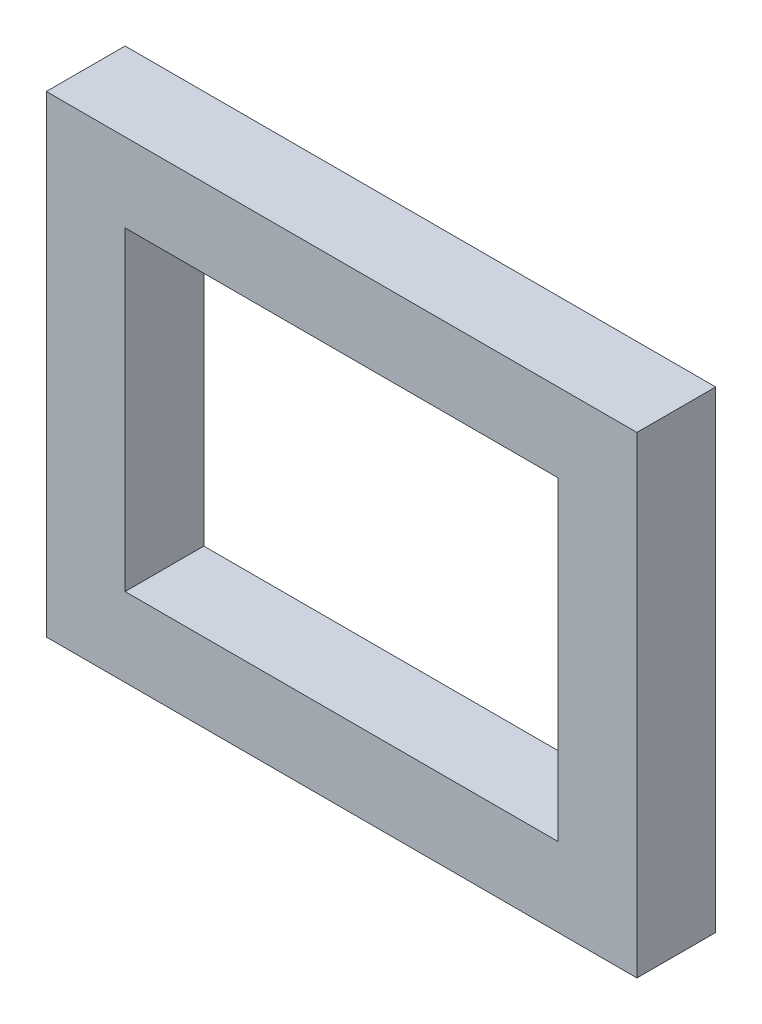
ISO-10303-21;
HEADER;
FILE_DESCRIPTION(('STEP AP214'),'2;1');
FILE_NAME('part.step','',(''),(''),'','','');
FILE_SCHEMA(('AUTOMOTIVE_DESIGN { 1 0 10303 214 1 1 1 1 }'));
ENDSEC;
DATA;
#1=APPLICATION_CONTEXT('core data for automotive mechanical design processes');
#2=APPLICATION_PROTOCOL_DEFINITION('international standard','automotive_design',2000,#1);
#3=PRODUCT_CONTEXT('',#1,'mechanical');
#4=PRODUCT('Part','Part','',(#3));
#5=PRODUCT_RELATED_PRODUCT_CATEGORY('part','',(#4));
#6=PRODUCT_DEFINITION_FORMATION('','',#4);
#7=PRODUCT_DEFINITION_CONTEXT('part definition',#1,'design');
#8=PRODUCT_DEFINITION('design','',#6,#7);
#9=PRODUCT_DEFINITION_SHAPE('','',#8);
#10=(LENGTH_UNIT() NAMED_UNIT(*) SI_UNIT(.MILLI.,.METRE.));
#11=(NAMED_UNIT(*) PLANE_ANGLE_UNIT() SI_UNIT($,.RADIAN.));
#12=(NAMED_UNIT(*) SI_UNIT($,.STERADIAN.) SOLID_ANGLE_UNIT());
#13=UNCERTAINTY_MEASURE_WITH_UNIT(LENGTH_MEASURE(1.E-05),#10,'distance_accuracy_value','');
#14=(GEOMETRIC_REPRESENTATION_CONTEXT(3) GLOBAL_UNCERTAINTY_ASSIGNED_CONTEXT((#13)) GLOBAL_UNIT_ASSIGNED_CONTEXT((#10,
#11,#12)) REPRESENTATION_CONTEXT('',''));
#15=CARTESIAN_POINT('',(0.,0.,0.));
#16=DIRECTION('',(0.,0.,1.));
#17=DIRECTION('',(1.,0.,0.));
#18=AXIS2_PLACEMENT_3D('',#15,#16,#17);
#19=CARTESIAN_POINT('',(0.,0.,10.));
#20=DIRECTION('',(0.,0.,-1.));
#21=DIRECTION('',(-1.,0.,0.));
#22=AXIS2_PLACEMENT_3D('',#19,#20,#21);
#23=PLANE('',#22);
#24=DIRECTION('',(0.,1.,0.));
#25=VECTOR('',#24,1.);
#26=CARTESIAN_POINT('',(37.5,-30.,10.));
#27=LINE('',#26,#25);
#28=CARTESIAN_POINT('',(37.5,-30.,10.));
#29=VERTEX_POINT('',#28);
#30=CARTESIAN_POINT('',(37.5,30.,10.));
#31=VERTEX_POINT('',#30);
#32=EDGE_CURVE('E136',#29,#31,#27,.T.);
#33=ORIENTED_EDGE('',*,*,#32,.T.);
#34=DIRECTION('',(-1.,0.,0.));
#35=VECTOR('',#34,1.);
#36=CARTESIAN_POINT('',(-37.5,30.,10.));
#37=LINE('',#36,#35);
#38=CARTESIAN_POINT('',(-37.5,30.,10.));
#39=VERTEX_POINT('',#38);
#40=EDGE_CURVE('E139',#31,#39,#37,.T.);
#41=ORIENTED_EDGE('',*,*,#40,.T.);
#42=DIRECTION('',(0.,-1.,0.));
#43=VECTOR('',#42,1.);
#44=CARTESIAN_POINT('',(-37.5,-30.,10.));
#45=LINE('',#44,#43);
#46=CARTESIAN_POINT('',(-37.5,-30.,10.));
#47=VERTEX_POINT('',#46);
#48=EDGE_CURVE('E142',#39,#47,#45,.T.);
#49=ORIENTED_EDGE('',*,*,#48,.T.);
#50=DIRECTION('',(1.,0.,0.));
#51=VECTOR('',#50,1.);
#52=CARTESIAN_POINT('',(-37.5,-30.,10.));
#53=LINE('',#52,#51);
#54=EDGE_CURVE('E144',#47,#29,#53,.T.);
#55=ORIENTED_EDGE('',*,*,#54,.T.);
#56=EDGE_LOOP('',(#33,#41,#49,#55));
#57=FACE_BOUND('',#56,.T.);
#58=DIRECTION('',(0.,1.,0.));
#59=VECTOR('',#58,1.);
#60=CARTESIAN_POINT('',(27.5,-20.,10.));
#61=LINE('',#60,#59);
#62=CARTESIAN_POINT('',(27.5,-20.,10.));
#63=VERTEX_POINT('',#62);
#64=CARTESIAN_POINT('',(27.5,20.,10.));
#65=VERTEX_POINT('',#64);
#66=EDGE_CURVE('E100',#63,#65,#61,.T.);
#67=ORIENTED_EDGE('',*,*,#66,.F.);
#68=DIRECTION('',(1.,0.,0.));
#69=VECTOR('',#68,1.);
#70=CARTESIAN_POINT('',(-27.5,-20.,10.));
#71=LINE('',#70,#69);
#72=CARTESIAN_POINT('',(-27.5,-20.,10.));
#73=VERTEX_POINT('',#72);
#74=EDGE_CURVE('E122',#73,#63,#71,.T.);
#75=ORIENTED_EDGE('',*,*,#74,.F.);
#76=DIRECTION('',(0.,-1.,0.));
#77=VECTOR('',#76,1.);
#78=CARTESIAN_POINT('',(-27.5,-20.,10.));
#79=LINE('',#78,#77);
#80=CARTESIAN_POINT('',(-27.5,20.,10.));
#81=VERTEX_POINT('',#80);
#82=EDGE_CURVE('E120',#81,#73,#79,.T.);
#83=ORIENTED_EDGE('',*,*,#82,.F.);
#84=DIRECTION('',(-1.,0.,0.));
#85=VECTOR('',#84,1.);
#86=CARTESIAN_POINT('',(-27.5,20.,10.));
#87=LINE('',#86,#85);
#88=EDGE_CURVE('E108',#65,#81,#87,.T.);
#89=ORIENTED_EDGE('',*,*,#88,.F.);
#90=EDGE_LOOP('',(#67,#75,#83,#89));
#91=FACE_BOUND('',#90,.T.);
#92=ADVANCED_FACE('F35',(#57,#91),#23,.F.);
#93=CARTESIAN_POINT('',(0.,0.,0.));
#94=DIRECTION('',(0.,0.,-1.));
#95=DIRECTION('',(-1.,0.,0.));
#96=AXIS2_PLACEMENT_3D('',#93,#94,#95);
#97=PLANE('',#96);
#98=DIRECTION('',(0.,1.,0.));
#99=VECTOR('',#98,1.);
#100=CARTESIAN_POINT('',(37.5,-30.,0.));
#101=LINE('',#100,#99);
#102=CARTESIAN_POINT('',(37.5,-30.,0.));
#103=VERTEX_POINT('',#102);
#104=CARTESIAN_POINT('',(37.5,30.,0.));
#105=VERTEX_POINT('',#104);
#106=EDGE_CURVE('E116',#103,#105,#101,.T.);
#107=ORIENTED_EDGE('',*,*,#106,.F.);
#108=DIRECTION('',(1.,0.,0.));
#109=VECTOR('',#108,1.);
#110=CARTESIAN_POINT('',(-37.5,-30.,0.));
#111=LINE('',#110,#109);
#112=CARTESIAN_POINT('',(-37.5,-30.,0.));
#113=VERTEX_POINT('',#112);
#114=EDGE_CURVE('E140',#113,#103,#111,.T.);
#115=ORIENTED_EDGE('',*,*,#114,.F.);
#116=DIRECTION('',(0.,-1.,0.));
#117=VECTOR('',#116,1.);
#118=CARTESIAN_POINT('',(-37.5,-30.,0.));
#119=LINE('',#118,#117);
#120=CARTESIAN_POINT('',(-37.5,30.,0.));
#121=VERTEX_POINT('',#120);
#122=EDGE_CURVE('E151',#121,#113,#119,.T.);
#123=ORIENTED_EDGE('',*,*,#122,.F.);
#124=DIRECTION('',(-1.,0.,0.));
#125=VECTOR('',#124,1.);
#126=CARTESIAN_POINT('',(-37.5,30.,0.));
#127=LINE('',#126,#125);
#128=EDGE_CURVE('E149',#105,#121,#127,.T.);
#129=ORIENTED_EDGE('',*,*,#128,.F.);
#130=EDGE_LOOP('',(#107,#115,#123,#129));
#131=FACE_BOUND('',#130,.T.);
#132=DIRECTION('',(1.,0.,0.));
#133=VECTOR('',#132,1.);
#134=CARTESIAN_POINT('',(-27.5,-20.,0.));
#135=LINE('',#134,#133);
#136=CARTESIAN_POINT('',(-27.5,-20.,0.));
#137=VERTEX_POINT('',#136);
#138=CARTESIAN_POINT('',(27.5,-20.,0.));
#139=VERTEX_POINT('',#138);
#140=EDGE_CURVE('E109',#137,#139,#135,.T.);
#141=ORIENTED_EDGE('',*,*,#140,.T.);
#142=DIRECTION('',(0.,1.,0.));
#143=VECTOR('',#142,1.);
#144=CARTESIAN_POINT('',(27.5,-20.,0.));
#145=LINE('',#144,#143);
#146=CARTESIAN_POINT('',(27.5,20.,0.));
#147=VERTEX_POINT('',#146);
#148=EDGE_CURVE('E58',#139,#147,#145,.T.);
#149=ORIENTED_EDGE('',*,*,#148,.T.);
#150=DIRECTION('',(-1.,0.,0.));
#151=VECTOR('',#150,1.);
#152=CARTESIAN_POINT('',(-27.5,20.,0.));
#153=LINE('',#152,#151);
#154=CARTESIAN_POINT('',(-27.5,20.,0.));
#155=VERTEX_POINT('',#154);
#156=EDGE_CURVE('E115',#147,#155,#153,.T.);
#157=ORIENTED_EDGE('',*,*,#156,.T.);
#158=DIRECTION('',(0.,-1.,0.));
#159=VECTOR('',#158,1.);
#160=CARTESIAN_POINT('',(-27.5,-20.,0.));
#161=LINE('',#160,#159);
#162=EDGE_CURVE('E128',#155,#137,#161,.T.);
#163=ORIENTED_EDGE('',*,*,#162,.T.);
#164=EDGE_LOOP('',(#141,#149,#157,#163));
#165=FACE_BOUND('',#164,.T.);
#166=ADVANCED_FACE('F169',(#131,#165),#97,.T.);
#167=CARTESIAN_POINT('',(37.5,-30.,10.));
#168=DIRECTION('',(-1.,0.,0.));
#169=DIRECTION('',(0.,0.,1.));
#170=AXIS2_PLACEMENT_3D('',#167,#168,#169);
#171=PLANE('',#170);
#172=ORIENTED_EDGE('',*,*,#106,.T.);
#173=DIRECTION('',(0.,0.,-1.));
#174=VECTOR('',#173,1.);
#175=CARTESIAN_POINT('',(37.5,30.,10.));
#176=LINE('',#175,#174);
#177=EDGE_CURVE('E11',#31,#105,#176,.T.);
#178=ORIENTED_EDGE('',*,*,#177,.F.);
#179=ORIENTED_EDGE('',*,*,#32,.F.);
#180=DIRECTION('',(0.,0.,-1.));
#181=VECTOR('',#180,1.);
#182=CARTESIAN_POINT('',(37.5,-30.,10.));
#183=LINE('',#182,#181);
#184=EDGE_CURVE('E146',#29,#103,#183,.T.);
#185=ORIENTED_EDGE('',*,*,#184,.T.);
#186=EDGE_LOOP('',(#172,#178,#179,#185));
#187=FACE_BOUND('',#186,.T.);
#188=ADVANCED_FACE('F37',(#187),#171,.F.);
#189=CARTESIAN_POINT('',(-37.5,30.,10.));
#190=DIRECTION('',(0.,-1.,0.));
#191=DIRECTION('',(0.,0.,-1.));
#192=AXIS2_PLACEMENT_3D('',#189,#190,#191);
#193=PLANE('',#192);
#194=ORIENTED_EDGE('',*,*,#128,.T.);
#195=DIRECTION('',(0.,0.,-1.));
#196=VECTOR('',#195,1.);
#197=CARTESIAN_POINT('',(-37.5,30.,10.));
#198=LINE('',#197,#196);
#199=EDGE_CURVE('E43',#39,#121,#198,.T.);
#200=ORIENTED_EDGE('',*,*,#199,.F.);
#201=ORIENTED_EDGE('',*,*,#40,.F.);
#202=ORIENTED_EDGE('',*,*,#177,.T.);
#203=EDGE_LOOP('',(#194,#200,#201,#202));
#204=FACE_BOUND('',#203,.T.);
#205=ADVANCED_FACE('F179',(#204),#193,.F.);
#206=CARTESIAN_POINT('',(-37.5,-30.,10.));
#207=DIRECTION('',(1.,0.,0.));
#208=DIRECTION('',(0.,0.,-1.));
#209=AXIS2_PLACEMENT_3D('',#206,#207,#208);
#210=PLANE('',#209);
#211=ORIENTED_EDGE('',*,*,#122,.T.);
#212=DIRECTION('',(0.,0.,-1.));
#213=VECTOR('',#212,1.);
#214=CARTESIAN_POINT('',(-37.5,-30.,10.));
#215=LINE('',#214,#213);
#216=EDGE_CURVE('E156',#47,#113,#215,.T.);
#217=ORIENTED_EDGE('',*,*,#216,.F.);
#218=ORIENTED_EDGE('',*,*,#48,.F.);
#219=ORIENTED_EDGE('',*,*,#199,.T.);
#220=EDGE_LOOP('',(#211,#217,#218,#219));
#221=FACE_BOUND('',#220,.T.);
#222=ADVANCED_FACE('F163',(#221),#210,.F.);
#223=CARTESIAN_POINT('',(-37.5,-30.,10.));
#224=DIRECTION('',(0.,1.,0.));
#225=DIRECTION('',(0.,0.,1.));
#226=AXIS2_PLACEMENT_3D('',#223,#224,#225);
#227=PLANE('',#226);
#228=ORIENTED_EDGE('',*,*,#114,.T.);
#229=ORIENTED_EDGE('',*,*,#184,.F.);
#230=ORIENTED_EDGE('',*,*,#54,.F.);
#231=ORIENTED_EDGE('',*,*,#216,.T.);
#232=EDGE_LOOP('',(#228,#229,#230,#231));
#233=FACE_BOUND('',#232,.T.);
#234=ADVANCED_FACE('F173',(#233),#227,.F.);
#235=CARTESIAN_POINT('',(27.5,-20.,10.));
#236=DIRECTION('',(-1.,0.,0.));
#237=DIRECTION('',(0.,0.,1.));
#238=AXIS2_PLACEMENT_3D('',#235,#236,#237);
#239=PLANE('',#238);
#240=ORIENTED_EDGE('',*,*,#148,.F.);
#241=DIRECTION('',(0.,0.,-1.));
#242=VECTOR('',#241,1.);
#243=CARTESIAN_POINT('',(27.5,-20.,10.));
#244=LINE('',#243,#242);
#245=EDGE_CURVE('E104',#63,#139,#244,.T.);
#246=ORIENTED_EDGE('',*,*,#245,.F.);
#247=ORIENTED_EDGE('',*,*,#66,.T.);
#248=DIRECTION('',(0.,0.,-1.));
#249=VECTOR('',#248,1.);
#250=CARTESIAN_POINT('',(27.5,20.,10.));
#251=LINE('',#250,#249);
#252=EDGE_CURVE('E103',#65,#147,#251,.T.);
#253=ORIENTED_EDGE('',*,*,#252,.T.);
#254=EDGE_LOOP('',(#240,#246,#247,#253));
#255=FACE_BOUND('',#254,.T.);
#256=ADVANCED_FACE('F102',(#255),#239,.T.);
#257=CARTESIAN_POINT('',(-27.5,20.,10.));
#258=DIRECTION('',(0.,-1.,0.));
#259=DIRECTION('',(0.,0.,-1.));
#260=AXIS2_PLACEMENT_3D('',#257,#258,#259);
#261=PLANE('',#260);
#262=ORIENTED_EDGE('',*,*,#156,.F.);
#263=ORIENTED_EDGE('',*,*,#252,.F.);
#264=ORIENTED_EDGE('',*,*,#88,.T.);
#265=DIRECTION('',(0.,0.,-1.));
#266=VECTOR('',#265,1.);
#267=CARTESIAN_POINT('',(-27.5,20.,10.));
#268=LINE('',#267,#266);
#269=EDGE_CURVE('E117',#81,#155,#268,.T.);
#270=ORIENTED_EDGE('',*,*,#269,.T.);
#271=EDGE_LOOP('',(#262,#263,#264,#270));
#272=FACE_BOUND('',#271,.T.);
#273=ADVANCED_FACE('F112',(#272),#261,.T.);
#274=CARTESIAN_POINT('',(-27.5,-20.,10.));
#275=DIRECTION('',(1.,0.,0.));
#276=DIRECTION('',(0.,0.,-1.));
#277=AXIS2_PLACEMENT_3D('',#274,#275,#276);
#278=PLANE('',#277);
#279=ORIENTED_EDGE('',*,*,#162,.F.);
#280=ORIENTED_EDGE('',*,*,#269,.F.);
#281=ORIENTED_EDGE('',*,*,#82,.T.);
#282=DIRECTION('',(0.,0.,-1.));
#283=VECTOR('',#282,1.);
#284=CARTESIAN_POINT('',(-27.5,-20.,10.));
#285=LINE('',#284,#283);
#286=EDGE_CURVE('E50',#73,#137,#285,.T.);
#287=ORIENTED_EDGE('',*,*,#286,.T.);
#288=EDGE_LOOP('',(#279,#280,#281,#287));
#289=FACE_BOUND('',#288,.T.);
#290=ADVANCED_FACE('F202',(#289),#278,.T.);
#291=CARTESIAN_POINT('',(-27.5,-20.,10.));
#292=DIRECTION('',(0.,1.,0.));
#293=DIRECTION('',(0.,0.,1.));
#294=AXIS2_PLACEMENT_3D('',#291,#292,#293);
#295=PLANE('',#294);
#296=ORIENTED_EDGE('',*,*,#140,.F.);
#297=ORIENTED_EDGE('',*,*,#286,.F.);
#298=ORIENTED_EDGE('',*,*,#74,.T.);
#299=ORIENTED_EDGE('',*,*,#245,.T.);
#300=EDGE_LOOP('',(#296,#297,#298,#299));
#301=FACE_BOUND('',#300,.T.);
#302=ADVANCED_FACE('F206',(#301),#295,.T.);
#303=CLOSED_SHELL('',(#92,#166,#188,#205,#222,#234,#256,#273,#290,#302));
#304=MANIFOLD_SOLID_BREP('B2',#303);
#305=ADVANCED_BREP_SHAPE_REPRESENTATION('',(#18,#304),#14);
#306=SHAPE_DEFINITION_REPRESENTATION(#9,#305);
ENDSEC;
END-ISO-10303-21;
